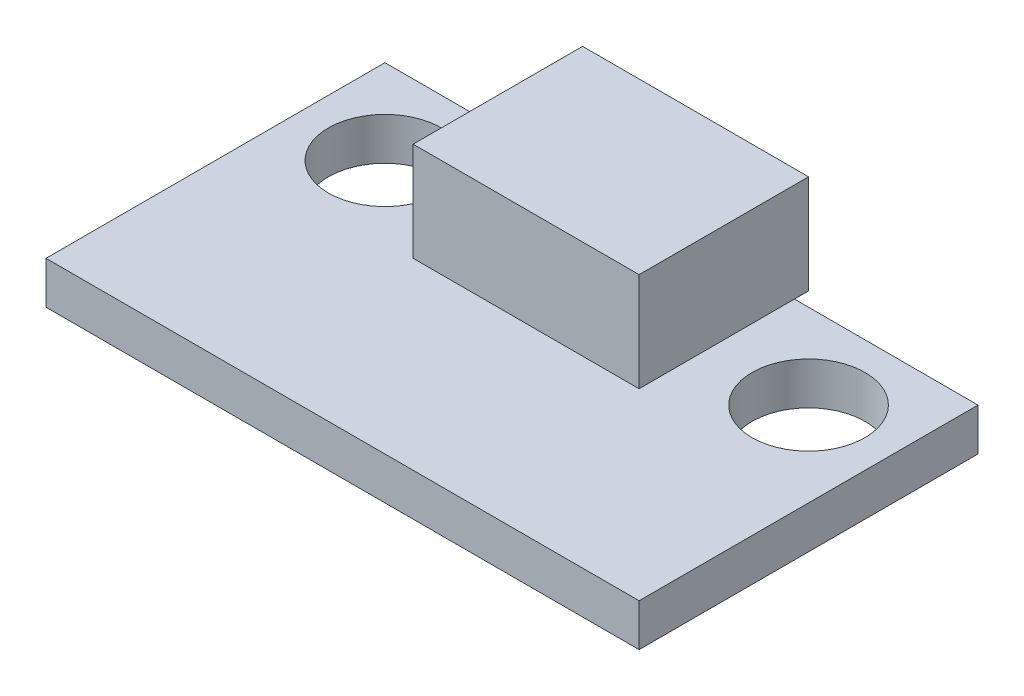
ISO-10303-21;
HEADER;
FILE_DESCRIPTION(('STEP AP214'),'2;1');
FILE_NAME('part.step','',(''),(''),'','','');
FILE_SCHEMA(('AUTOMOTIVE_DESIGN { 1 0 10303 214 1 1 1 1 }'));
ENDSEC;
DATA;
#1=APPLICATION_CONTEXT('core data for automotive mechanical design processes');
#2=APPLICATION_PROTOCOL_DEFINITION('international standard','automotive_design',2000,#1);
#3=PRODUCT_CONTEXT('',#1,'mechanical');
#4=PRODUCT('Part','Part','',(#3));
#5=PRODUCT_RELATED_PRODUCT_CATEGORY('part','',(#4));
#6=PRODUCT_DEFINITION_FORMATION('','',#4);
#7=PRODUCT_DEFINITION_CONTEXT('part definition',#1,'design');
#8=PRODUCT_DEFINITION('design','',#6,#7);
#9=PRODUCT_DEFINITION_SHAPE('','',#8);
#10=(LENGTH_UNIT() NAMED_UNIT(*) SI_UNIT(.MILLI.,.METRE.));
#11=(NAMED_UNIT(*) PLANE_ANGLE_UNIT() SI_UNIT($,.RADIAN.));
#12=(NAMED_UNIT(*) SI_UNIT($,.STERADIAN.) SOLID_ANGLE_UNIT());
#13=UNCERTAINTY_MEASURE_WITH_UNIT(LENGTH_MEASURE(1.E-05),#10,'distance_accuracy_value','');
#14=(GEOMETRIC_REPRESENTATION_CONTEXT(3) GLOBAL_UNCERTAINTY_ASSIGNED_CONTEXT((#13)) GLOBAL_UNIT_ASSIGNED_CONTEXT((#10,
#11,#12)) REPRESENTATION_CONTEXT('',''));
#15=CARTESIAN_POINT('',(0.,0.,0.));
#16=DIRECTION('',(0.,0.,1.));
#17=DIRECTION('',(1.,0.,0.));
#18=AXIS2_PLACEMENT_3D('',#15,#16,#17);
#19=CARTESIAN_POINT('',(10.5,1.5,-6.));
#20=DIRECTION('',(-1.,0.,0.));
#21=DIRECTION('',(0.,0.,1.));
#22=AXIS2_PLACEMENT_3D('',#19,#20,#21);
#23=PLANE('',#22);
#24=DIRECTION('',(0.,0.,-1.));
#25=VECTOR('',#24,1.);
#26=CARTESIAN_POINT('',(10.5,0.,-6.));
#27=LINE('',#26,#25);
#28=CARTESIAN_POINT('',(10.5,0.,6.));
#29=VERTEX_POINT('',#28);
#30=CARTESIAN_POINT('',(10.5,0.,-6.));
#31=VERTEX_POINT('',#30);
#32=EDGE_CURVE('E143',#29,#31,#27,.T.);
#33=ORIENTED_EDGE('',*,*,#32,.T.);
#34=DIRECTION('',(0.,-1.,0.));
#35=VECTOR('',#34,1.);
#36=CARTESIAN_POINT('',(10.5,1.5,-6.));
#37=LINE('',#36,#35);
#38=CARTESIAN_POINT('',(10.5,1.5,-6.));
#39=VERTEX_POINT('',#38);
#40=EDGE_CURVE('E36',#39,#31,#37,.T.);
#41=ORIENTED_EDGE('',*,*,#40,.F.);
#42=DIRECTION('',(0.,0.,-1.));
#43=VECTOR('',#42,1.);
#44=CARTESIAN_POINT('',(10.5,1.5,-6.));
#45=LINE('',#44,#43);
#46=CARTESIAN_POINT('',(10.5,1.5,6.));
#47=VERTEX_POINT('',#46);
#48=EDGE_CURVE('E146',#47,#39,#45,.T.);
#49=ORIENTED_EDGE('',*,*,#48,.F.);
#50=DIRECTION('',(0.,-1.,0.));
#51=VECTOR('',#50,1.);
#52=CARTESIAN_POINT('',(10.5,1.5,6.));
#53=LINE('',#52,#51);
#54=EDGE_CURVE('E158',#47,#29,#53,.T.);
#55=ORIENTED_EDGE('',*,*,#54,.T.);
#56=EDGE_LOOP('',(#33,#41,#49,#55));
#57=FACE_BOUND('',#56,.T.);
#58=ADVANCED_FACE('F33',(#57),#23,.F.);
#59=CARTESIAN_POINT('',(-10.5,1.5,-6.));
#60=DIRECTION('',(0.,0.,1.));
#61=DIRECTION('',(1.,0.,0.));
#62=AXIS2_PLACEMENT_3D('',#59,#60,#61);
#63=PLANE('',#62);
#64=DIRECTION('',(-1.,0.,0.));
#65=VECTOR('',#64,1.);
#66=CARTESIAN_POINT('',(-10.5,0.,-6.));
#67=LINE('',#66,#65);
#68=CARTESIAN_POINT('',(-10.5,0.,-6.));
#69=VERTEX_POINT('',#68);
#70=EDGE_CURVE('E161',#31,#69,#67,.T.);
#71=ORIENTED_EDGE('',*,*,#70,.T.);
#72=DIRECTION('',(0.,-1.,0.));
#73=VECTOR('',#72,1.);
#74=CARTESIAN_POINT('',(-10.5,1.5,-6.));
#75=LINE('',#74,#73);
#76=CARTESIAN_POINT('',(-10.5,1.5,-6.));
#77=VERTEX_POINT('',#76);
#78=EDGE_CURVE('E170',#77,#69,#75,.T.);
#79=ORIENTED_EDGE('',*,*,#78,.F.);
#80=DIRECTION('',(-1.,0.,0.));
#81=VECTOR('',#80,1.);
#82=CARTESIAN_POINT('',(-10.5,1.5,-6.));
#83=LINE('',#82,#81);
#84=CARTESIAN_POINT('',(-4.,1.5,-6.));
#85=VERTEX_POINT('',#84);
#86=EDGE_CURVE('E149',#85,#77,#83,.T.);
#87=ORIENTED_EDGE('',*,*,#86,.F.);
#88=CARTESIAN_POINT('',(4.,1.5,-6.));
#89=VERTEX_POINT('',#88);
#90=EDGE_CURVE('E154',#89,#85,#83,.T.);
#91=ORIENTED_EDGE('',*,*,#90,.F.);
#92=EDGE_CURVE('E151',#39,#89,#83,.T.);
#93=ORIENTED_EDGE('',*,*,#92,.F.);
#94=ORIENTED_EDGE('',*,*,#40,.T.);
#95=EDGE_LOOP('',(#71,#79,#87,#91,#93,#94));
#96=FACE_BOUND('',#95,.T.);
#97=ADVANCED_FACE('F179',(#96),#63,.F.);
#98=CARTESIAN_POINT('',(-10.5,1.5,-6.));
#99=DIRECTION('',(1.,0.,0.));
#100=DIRECTION('',(0.,0.,-1.));
#101=AXIS2_PLACEMENT_3D('',#98,#99,#100);
#102=PLANE('',#101);
#103=DIRECTION('',(0.,0.,1.));
#104=VECTOR('',#103,1.);
#105=CARTESIAN_POINT('',(-10.5,0.,-6.));
#106=LINE('',#105,#104);
#107=CARTESIAN_POINT('',(-10.5,0.,6.));
#108=VERTEX_POINT('',#107);
#109=EDGE_CURVE('E163',#69,#108,#106,.T.);
#110=ORIENTED_EDGE('',*,*,#109,.T.);
#111=DIRECTION('',(0.,-1.,0.));
#112=VECTOR('',#111,1.);
#113=CARTESIAN_POINT('',(-10.5,1.5,6.));
#114=LINE('',#113,#112);
#115=CARTESIAN_POINT('',(-10.5,1.5,6.));
#116=VERTEX_POINT('',#115);
#117=EDGE_CURVE('E168',#116,#108,#114,.T.);
#118=ORIENTED_EDGE('',*,*,#117,.F.);
#119=DIRECTION('',(0.,0.,1.));
#120=VECTOR('',#119,1.);
#121=CARTESIAN_POINT('',(-10.5,1.5,-6.));
#122=LINE('',#121,#120);
#123=EDGE_CURVE('E153',#77,#116,#122,.T.);
#124=ORIENTED_EDGE('',*,*,#123,.F.);
#125=ORIENTED_EDGE('',*,*,#78,.T.);
#126=EDGE_LOOP('',(#110,#118,#124,#125));
#127=FACE_BOUND('',#126,.T.);
#128=ADVANCED_FACE('F188',(#127),#102,.F.);
#129=CARTESIAN_POINT('',(-10.5,1.5,6.));
#130=DIRECTION('',(0.,0.,-1.));
#131=DIRECTION('',(-1.,0.,0.));
#132=AXIS2_PLACEMENT_3D('',#129,#130,#131);
#133=PLANE('',#132);
#134=DIRECTION('',(1.,0.,0.));
#135=VECTOR('',#134,1.);
#136=CARTESIAN_POINT('',(-10.5,0.,6.));
#137=LINE('',#136,#135);
#138=EDGE_CURVE('E150',#108,#29,#137,.T.);
#139=ORIENTED_EDGE('',*,*,#138,.T.);
#140=ORIENTED_EDGE('',*,*,#54,.F.);
#141=DIRECTION('',(1.,0.,0.));
#142=VECTOR('',#141,1.);
#143=CARTESIAN_POINT('',(-10.5,1.5,6.));
#144=LINE('',#143,#142);
#145=EDGE_CURVE('E156',#116,#47,#144,.T.);
#146=ORIENTED_EDGE('',*,*,#145,.F.);
#147=ORIENTED_EDGE('',*,*,#117,.T.);
#148=EDGE_LOOP('',(#139,#140,#146,#147));
#149=FACE_BOUND('',#148,.T.);
#150=ADVANCED_FACE('F191',(#149),#133,.F.);
#151=CARTESIAN_POINT('',(0.,1.5,0.));
#152=DIRECTION('',(0.,1.,0.));
#153=DIRECTION('',(0.,0.,1.));
#154=AXIS2_PLACEMENT_3D('',#151,#152,#153);
#155=PLANE('',#154);
#156=DIRECTION('',(0.,0.,-1.));
#157=VECTOR('',#156,1.);
#158=CARTESIAN_POINT('',(4.,1.5,-6.5));
#159=LINE('',#158,#157);
#160=CARTESIAN_POINT('',(4.,1.5,-0.5));
#161=VERTEX_POINT('',#160);
#162=EDGE_CURVE('E49',#161,#89,#159,.T.);
#163=ORIENTED_EDGE('',*,*,#162,.F.);
#164=DIRECTION('',(1.,0.,0.));
#165=VECTOR('',#164,1.);
#166=CARTESIAN_POINT('',(-4.,1.5,-0.5));
#167=LINE('',#166,#165);
#168=CARTESIAN_POINT('',(-4.,1.5,-0.5));
#169=VERTEX_POINT('',#168);
#170=EDGE_CURVE('E122',#169,#161,#167,.T.);
#171=ORIENTED_EDGE('',*,*,#170,.F.);
#172=DIRECTION('',(0.,0.,1.));
#173=VECTOR('',#172,1.);
#174=CARTESIAN_POINT('',(-4.,1.5,-6.5));
#175=LINE('',#174,#173);
#176=EDGE_CURVE('E11',#85,#169,#175,.T.);
#177=ORIENTED_EDGE('',*,*,#176,.F.);
#178=ORIENTED_EDGE('',*,*,#86,.T.);
#179=ORIENTED_EDGE('',*,*,#123,.T.);
#180=ORIENTED_EDGE('',*,*,#145,.T.);
#181=ORIENTED_EDGE('',*,*,#48,.T.);
#182=ORIENTED_EDGE('',*,*,#92,.T.);
#183=EDGE_LOOP('',(#163,#171,#177,#178,#179,#180,#181,#182));
#184=FACE_BOUND('',#183,.T.);
#185=CARTESIAN_POINT('',(7.5,1.5,-3.));
#186=DIRECTION('',(0.,1.,0.));
#187=DIRECTION('',(0.,0.,1.));
#188=AXIS2_PLACEMENT_3D('',#185,#186,#187);
#189=CIRCLE('',#188,2.);
#190=CARTESIAN_POINT('',(7.5,1.5,-1.));
#191=VERTEX_POINT('',#190);
#192=EDGE_CURVE('E128',#191,#191,#189,.T.);
#193=ORIENTED_EDGE('',*,*,#192,.F.);
#194=EDGE_LOOP('',(#193));
#195=FACE_BOUND('',#194,.T.);
#196=CARTESIAN_POINT('',(-7.5,1.5,-3.));
#197=DIRECTION('',(0.,1.,0.));
#198=DIRECTION('',(0.,0.,1.));
#199=AXIS2_PLACEMENT_3D('',#196,#197,#198);
#200=CIRCLE('',#199,2.);
#201=CARTESIAN_POINT('',(-7.5,1.5,-1.));
#202=VERTEX_POINT('',#201);
#203=EDGE_CURVE('E138',#202,#202,#200,.T.);
#204=ORIENTED_EDGE('',*,*,#203,.F.);
#205=EDGE_LOOP('',(#204));
#206=FACE_BOUND('',#205,.T.);
#207=ADVANCED_FACE('F192',(#184,#195,#206),#155,.T.);
#208=CARTESIAN_POINT('',(0.,0.,0.));
#209=DIRECTION('',(0.,1.,0.));
#210=DIRECTION('',(0.,0.,1.));
#211=AXIS2_PLACEMENT_3D('',#208,#209,#210);
#212=PLANE('',#211);
#213=CARTESIAN_POINT('',(7.5,0.,-3.));
#214=DIRECTION('',(0.,1.,0.));
#215=DIRECTION('',(0.,0.,1.));
#216=AXIS2_PLACEMENT_3D('',#213,#214,#215);
#217=CIRCLE('',#216,2.);
#218=CARTESIAN_POINT('',(7.5,0.,-1.));
#219=VERTEX_POINT('',#218);
#220=EDGE_CURVE('E131',#219,#219,#217,.T.);
#221=ORIENTED_EDGE('',*,*,#220,.T.);
#222=EDGE_LOOP('',(#221));
#223=FACE_BOUND('',#222,.T.);
#224=CARTESIAN_POINT('',(-7.5,0.,-3.));
#225=DIRECTION('',(0.,1.,0.));
#226=DIRECTION('',(0.,0.,1.));
#227=AXIS2_PLACEMENT_3D('',#224,#225,#226);
#228=CIRCLE('',#227,2.);
#229=CARTESIAN_POINT('',(-7.5,0.,-1.));
#230=VERTEX_POINT('',#229);
#231=EDGE_CURVE('E140',#230,#230,#228,.T.);
#232=ORIENTED_EDGE('',*,*,#231,.T.);
#233=EDGE_LOOP('',(#232));
#234=FACE_BOUND('',#233,.T.);
#235=ORIENTED_EDGE('',*,*,#32,.F.);
#236=ORIENTED_EDGE('',*,*,#138,.F.);
#237=ORIENTED_EDGE('',*,*,#109,.F.);
#238=ORIENTED_EDGE('',*,*,#70,.F.);
#239=EDGE_LOOP('',(#235,#236,#237,#238));
#240=FACE_BOUND('',#239,.T.);
#241=ADVANCED_FACE('F186',(#223,#234,#240),#212,.F.);
#242=CARTESIAN_POINT('',(-7.5,0.,-3.));
#243=DIRECTION('',(0.,1.,0.));
#244=DIRECTION('',(0.,0.,1.));
#245=AXIS2_PLACEMENT_3D('',#242,#243,#244);
#246=CYLINDRICAL_SURFACE('',#245,2.);
#247=ORIENTED_EDGE('',*,*,#231,.F.);
#248=EDGE_LOOP('',(#247));
#249=FACE_BOUND('',#248,.T.);
#250=ORIENTED_EDGE('',*,*,#203,.T.);
#251=EDGE_LOOP('',(#250));
#252=FACE_BOUND('',#251,.T.);
#253=ADVANCED_FACE('F235',(#249,#252),#246,.F.);
#254=CARTESIAN_POINT('',(7.5,0.,-3.));
#255=DIRECTION('',(0.,1.,0.));
#256=DIRECTION('',(0.,0.,1.));
#257=AXIS2_PLACEMENT_3D('',#254,#255,#256);
#258=CYLINDRICAL_SURFACE('',#257,2.);
#259=ORIENTED_EDGE('',*,*,#220,.F.);
#260=EDGE_LOOP('',(#259));
#261=FACE_BOUND('',#260,.T.);
#262=ORIENTED_EDGE('',*,*,#192,.T.);
#263=EDGE_LOOP('',(#262));
#264=FACE_BOUND('',#263,.T.);
#265=ADVANCED_FACE('F241',(#261,#264),#258,.F.);
#266=CARTESIAN_POINT('',(0.,1.5,0.));
#267=DIRECTION('',(0.,1.,0.));
#268=DIRECTION('',(0.,0.,1.));
#269=AXIS2_PLACEMENT_3D('',#266,#267,#268);
#270=PLANE('',#269);
#271=CARTESIAN_POINT('',(4.,1.5,-6.5));
#272=VERTEX_POINT('',#271);
#273=EDGE_CURVE('E126',#89,#272,#159,.T.);
#274=ORIENTED_EDGE('',*,*,#273,.F.);
#275=ORIENTED_EDGE('',*,*,#90,.T.);
#276=CARTESIAN_POINT('',(-4.,1.5,-6.5));
#277=VERTEX_POINT('',#276);
#278=EDGE_CURVE('E42',#277,#85,#175,.T.);
#279=ORIENTED_EDGE('',*,*,#278,.F.);
#280=DIRECTION('',(-1.,0.,0.));
#281=VECTOR('',#280,1.);
#282=CARTESIAN_POINT('',(-4.,1.5,-6.5));
#283=LINE('',#282,#281);
#284=EDGE_CURVE('E203',#272,#277,#283,.T.);
#285=ORIENTED_EDGE('',*,*,#284,.F.);
#286=EDGE_LOOP('',(#274,#275,#279,#285));
#287=FACE_BOUND('',#286,.T.);
#288=ADVANCED_FACE('F198',(#287),#270,.F.);
#289=CARTESIAN_POINT('',(4.,5.,-6.5));
#290=DIRECTION('',(-1.,0.,0.));
#291=DIRECTION('',(0.,0.,1.));
#292=AXIS2_PLACEMENT_3D('',#289,#290,#291);
#293=PLANE('',#292);
#294=ORIENTED_EDGE('',*,*,#162,.T.);
#295=ORIENTED_EDGE('',*,*,#273,.T.);
#296=DIRECTION('',(0.,-1.,0.));
#297=VECTOR('',#296,1.);
#298=CARTESIAN_POINT('',(4.,5.,-6.5));
#299=LINE('',#298,#297);
#300=CARTESIAN_POINT('',(4.,5.,-6.5));
#301=VERTEX_POINT('',#300);
#302=EDGE_CURVE('E107',#301,#272,#299,.T.);
#303=ORIENTED_EDGE('',*,*,#302,.F.);
#304=DIRECTION('',(0.,0.,-1.));
#305=VECTOR('',#304,1.);
#306=CARTESIAN_POINT('',(4.,5.,-6.5));
#307=LINE('',#306,#305);
#308=CARTESIAN_POINT('',(4.,5.,-0.5));
#309=VERTEX_POINT('',#308);
#310=EDGE_CURVE('E113',#309,#301,#307,.T.);
#311=ORIENTED_EDGE('',*,*,#310,.F.);
#312=DIRECTION('',(0.,-1.,0.));
#313=VECTOR('',#312,1.);
#314=CARTESIAN_POINT('',(4.,5.,-0.5));
#315=LINE('',#314,#313);
#316=EDGE_CURVE('E208',#309,#161,#315,.T.);
#317=ORIENTED_EDGE('',*,*,#316,.T.);
#318=EDGE_LOOP('',(#294,#295,#303,#311,#317));
#319=FACE_BOUND('',#318,.T.);
#320=ADVANCED_FACE('F124',(#319),#293,.F.);
#321=CARTESIAN_POINT('',(-4.,5.,-6.5));
#322=DIRECTION('',(0.,0.,1.));
#323=DIRECTION('',(1.,0.,0.));
#324=AXIS2_PLACEMENT_3D('',#321,#322,#323);
#325=PLANE('',#324);
#326=ORIENTED_EDGE('',*,*,#284,.T.);
#327=DIRECTION('',(0.,-1.,0.));
#328=VECTOR('',#327,1.);
#329=CARTESIAN_POINT('',(-4.,5.,-6.5));
#330=LINE('',#329,#328);
#331=CARTESIAN_POINT('',(-4.,5.,-6.5));
#332=VERTEX_POINT('',#331);
#333=EDGE_CURVE('E109',#332,#277,#330,.T.);
#334=ORIENTED_EDGE('',*,*,#333,.F.);
#335=DIRECTION('',(-1.,0.,0.));
#336=VECTOR('',#335,1.);
#337=CARTESIAN_POINT('',(-4.,5.,-6.5));
#338=LINE('',#337,#336);
#339=EDGE_CURVE('E103',#301,#332,#338,.T.);
#340=ORIENTED_EDGE('',*,*,#339,.F.);
#341=ORIENTED_EDGE('',*,*,#302,.T.);
#342=EDGE_LOOP('',(#326,#334,#340,#341));
#343=FACE_BOUND('',#342,.T.);
#344=ADVANCED_FACE('F105',(#343),#325,.F.);
#345=CARTESIAN_POINT('',(-4.,5.,-6.5));
#346=DIRECTION('',(1.,0.,0.));
#347=DIRECTION('',(0.,0.,-1.));
#348=AXIS2_PLACEMENT_3D('',#345,#346,#347);
#349=PLANE('',#348);
#350=ORIENTED_EDGE('',*,*,#278,.T.);
#351=ORIENTED_EDGE('',*,*,#176,.T.);
#352=DIRECTION('',(0.,-1.,0.));
#353=VECTOR('',#352,1.);
#354=CARTESIAN_POINT('',(-4.,5.,-0.5));
#355=LINE('',#354,#353);
#356=CARTESIAN_POINT('',(-4.,5.,-0.5));
#357=VERTEX_POINT('',#356);
#358=EDGE_CURVE('E133',#357,#169,#355,.T.);
#359=ORIENTED_EDGE('',*,*,#358,.F.);
#360=DIRECTION('',(0.,0.,1.));
#361=VECTOR('',#360,1.);
#362=CARTESIAN_POINT('',(-4.,5.,-6.5));
#363=LINE('',#362,#361);
#364=EDGE_CURVE('E112',#332,#357,#363,.T.);
#365=ORIENTED_EDGE('',*,*,#364,.F.);
#366=ORIENTED_EDGE('',*,*,#333,.T.);
#367=EDGE_LOOP('',(#350,#351,#359,#365,#366));
#368=FACE_BOUND('',#367,.T.);
#369=ADVANCED_FACE('F200',(#368),#349,.F.);
#370=CARTESIAN_POINT('',(-4.,5.,-0.5));
#371=DIRECTION('',(0.,0.,-1.));
#372=DIRECTION('',(-1.,0.,0.));
#373=AXIS2_PLACEMENT_3D('',#370,#371,#372);
#374=PLANE('',#373);
#375=ORIENTED_EDGE('',*,*,#170,.T.);
#376=ORIENTED_EDGE('',*,*,#316,.F.);
#377=DIRECTION('',(1.,0.,0.));
#378=VECTOR('',#377,1.);
#379=CARTESIAN_POINT('',(-4.,5.,-0.5));
#380=LINE('',#379,#378);
#381=EDGE_CURVE('E118',#357,#309,#380,.T.);
#382=ORIENTED_EDGE('',*,*,#381,.F.);
#383=ORIENTED_EDGE('',*,*,#358,.T.);
#384=EDGE_LOOP('',(#375,#376,#382,#383));
#385=FACE_BOUND('',#384,.T.);
#386=ADVANCED_FACE('F210',(#385),#374,.F.);
#387=CARTESIAN_POINT('',(0.,5.,0.));
#388=DIRECTION('',(0.,1.,0.));
#389=DIRECTION('',(0.,0.,1.));
#390=AXIS2_PLACEMENT_3D('',#387,#388,#389);
#391=PLANE('',#390);
#392=ORIENTED_EDGE('',*,*,#310,.T.);
#393=ORIENTED_EDGE('',*,*,#339,.T.);
#394=ORIENTED_EDGE('',*,*,#364,.T.);
#395=ORIENTED_EDGE('',*,*,#381,.T.);
#396=EDGE_LOOP('',(#392,#393,#394,#395));
#397=FACE_BOUND('',#396,.T.);
#398=ADVANCED_FACE('F116',(#397),#391,.T.);
#399=CLOSED_SHELL('',(#58,#97,#128,#150,#207,#241,#253,#265,#288,#320,#344,#369,#386,#398));
#400=MANIFOLD_SOLID_BREP('B2',#399);
#401=ADVANCED_BREP_SHAPE_REPRESENTATION('',(#18,#400),#14);
#402=SHAPE_DEFINITION_REPRESENTATION(#9,#401);
ENDSEC;
END-ISO-10303-21;
